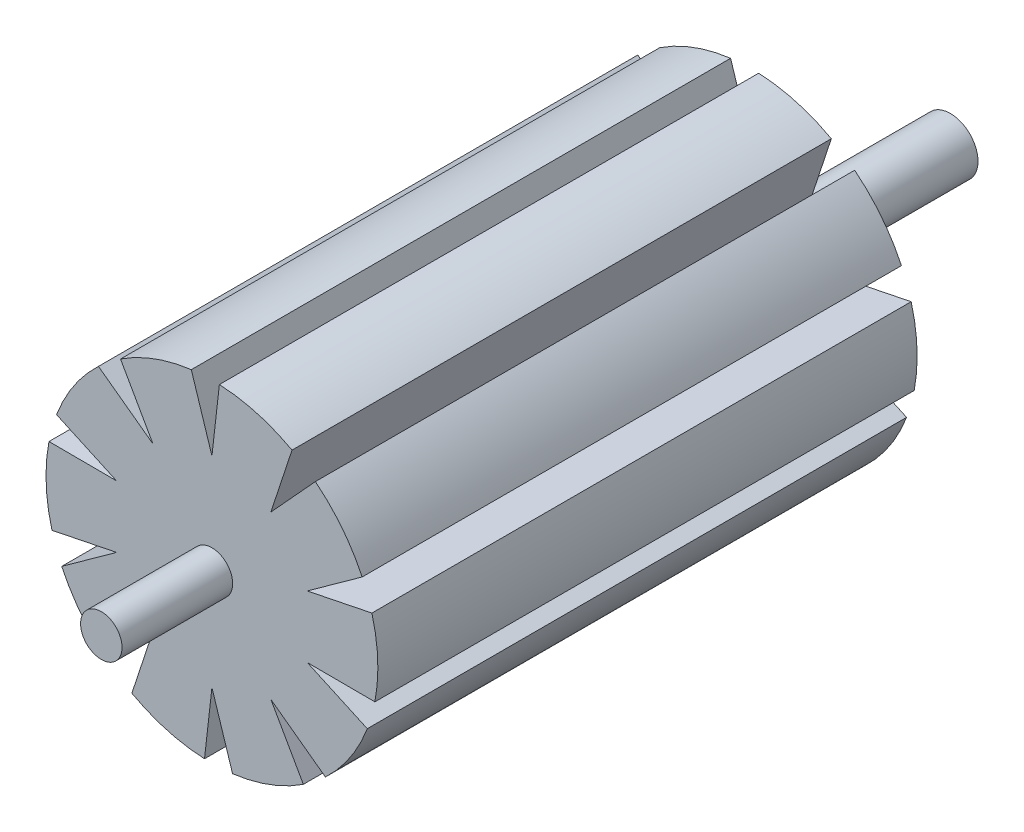
ISO-10303-21;
HEADER;
FILE_DESCRIPTION(('STEP AP214'),'2;1');
FILE_NAME('part.step','',(''),(''),'','','');
FILE_SCHEMA(('AUTOMOTIVE_DESIGN { 1 0 10303 214 1 1 1 1 }'));
ENDSEC;
DATA;
#1=APPLICATION_CONTEXT('core data for automotive mechanical design processes');
#2=APPLICATION_PROTOCOL_DEFINITION('international standard','automotive_design',2000,#1);
#3=PRODUCT_CONTEXT('',#1,'mechanical');
#4=PRODUCT('Part','Part','',(#3));
#5=PRODUCT_RELATED_PRODUCT_CATEGORY('part','',(#4));
#6=PRODUCT_DEFINITION_FORMATION('','',#4);
#7=PRODUCT_DEFINITION_CONTEXT('part definition',#1,'design');
#8=PRODUCT_DEFINITION('design','',#6,#7);
#9=PRODUCT_DEFINITION_SHAPE('','',#8);
#10=(LENGTH_UNIT() NAMED_UNIT(*) SI_UNIT(.MILLI.,.METRE.));
#11=(NAMED_UNIT(*) PLANE_ANGLE_UNIT() SI_UNIT($,.RADIAN.));
#12=(NAMED_UNIT(*) SI_UNIT($,.STERADIAN.) SOLID_ANGLE_UNIT());
#13=UNCERTAINTY_MEASURE_WITH_UNIT(LENGTH_MEASURE(1.E-05),#10,'distance_accuracy_value','');
#14=(GEOMETRIC_REPRESENTATION_CONTEXT(3) GLOBAL_UNCERTAINTY_ASSIGNED_CONTEXT((#13)) GLOBAL_UNIT_ASSIGNED_CONTEXT((#10,
#11,#12)) REPRESENTATION_CONTEXT('',''));
#15=CARTESIAN_POINT('',(0.,0.,0.));
#16=DIRECTION('',(0.,0.,1.));
#17=DIRECTION('',(1.,0.,0.));
#18=AXIS2_PLACEMENT_3D('',#15,#16,#17);
#19=CARTESIAN_POINT('',(0.,0.,19.5));
#20=DIRECTION('',(0.,0.,-1.));
#21=DIRECTION('',(-1.,0.,0.));
#22=AXIS2_PLACEMENT_3D('',#19,#20,#21);
#23=CYLINDRICAL_SURFACE('',#22,6.);
#24=DIRECTION('',(0.,0.,-1.));
#25=VECTOR('',#24,1.);
#26=CARTESIAN_POINT('',(3.30575995609394,-5.00718994174235,19.5));
#27=LINE('',#26,#25);
#28=CARTESIAN_POINT('',(3.30575995609394,-5.00718994174235,19.5));
#29=VERTEX_POINT('',#28);
#30=CARTESIAN_POINT('',(3.30575995609394,-5.00718994174235,0.));
#31=VERTEX_POINT('',#30);
#32=EDGE_CURVE('E591',#29,#31,#27,.T.);
#33=ORIENTED_EDGE('',*,*,#32,.F.);
#34=CARTESIAN_POINT('',(0.,0.,19.5));
#35=DIRECTION('',(0.,0.,1.));
#36=DIRECTION('',(1.,0.,0.));
#37=AXIS2_PLACEMENT_3D('',#34,#35,#36);
#38=CIRCLE('',#37,6.);
#39=CARTESIAN_POINT('',(0.745999923729571,-5.95344304699352,19.5));
#40=VERTEX_POINT('',#39);
#41=EDGE_CURVE('E618',#40,#29,#38,.T.);
#42=ORIENTED_EDGE('',*,*,#41,.F.);
#43=DIRECTION('',(0.,0.,-1.));
#44=VECTOR('',#43,1.);
#45=CARTESIAN_POINT('',(0.745999923729571,-5.95344304699352,19.5));
#46=LINE('',#45,#44);
#47=CARTESIAN_POINT('',(0.745999923729571,-5.95344304699352,0.));
#48=VERTEX_POINT('',#47);
#49=EDGE_CURVE('E583',#40,#48,#46,.T.);
#50=ORIENTED_EDGE('',*,*,#49,.T.);
#51=CARTESIAN_POINT('',(0.,0.,0.));
#52=DIRECTION('',(0.,0.,1.));
#53=DIRECTION('',(1.,0.,0.));
#54=AXIS2_PLACEMENT_3D('',#51,#52,#53);
#55=CIRCLE('',#54,6.);
#56=EDGE_CURVE('E635',#48,#31,#55,.T.);
#57=ORIENTED_EDGE('',*,*,#56,.T.);
#58=EDGE_LOOP('',(#33,#42,#50,#57));
#59=FACE_BOUND('',#58,.T.);
#60=ADVANCED_FACE('F147',(#59),#23,.T.);
#61=DIRECTION('',(0.,0.,-1.));
#62=VECTOR('',#61,1.);
#63=CARTESIAN_POINT('',(-0.268736419379183,-5.9939787067439,19.5));
#64=LINE('',#63,#62);
#65=CARTESIAN_POINT('',(-0.268736419379183,-5.9939787067439,19.5));
#66=VERTEX_POINT('',#65);
#67=CARTESIAN_POINT('',(-0.268736419379183,-5.9939787067439,0.));
#68=VERTEX_POINT('',#67);
#69=EDGE_CURVE('E577',#66,#68,#64,.T.);
#70=ORIENTED_EDGE('',*,*,#69,.F.);
#71=CARTESIAN_POINT('',(-2.89581940728632,-5.25492435344068,19.5));
#72=VERTEX_POINT('',#71);
#73=EDGE_CURVE('E693',#72,#66,#38,.T.);
#74=ORIENTED_EDGE('',*,*,#73,.F.);
#75=DIRECTION('',(0.,0.,-1.));
#76=VECTOR('',#75,1.);
#77=CARTESIAN_POINT('',(-2.89581940728632,-5.25492435344068,19.5));
#78=LINE('',#77,#76);
#79=CARTESIAN_POINT('',(-2.89581940728632,-5.25492435344068,0.));
#80=VERTEX_POINT('',#79);
#81=EDGE_CURVE('E528',#72,#80,#78,.T.);
#82=ORIENTED_EDGE('',*,*,#81,.T.);
#83=EDGE_CURVE('E639',#80,#68,#55,.T.);
#84=ORIENTED_EDGE('',*,*,#83,.T.);
#85=EDGE_LOOP('',(#70,#74,#82,#84));
#86=FACE_BOUND('',#85,.T.);
#87=ADVANCED_FACE('F756',(#86),#23,.T.);
#88=CARTESIAN_POINT('',(4.10287263948559,-4.37794884668157,19.5));
#89=VERTEX_POINT('',#88);
#90=CARTESIAN_POINT('',(5.61756838698754,-2.10782480712183,19.5));
#91=VERTEX_POINT('',#90);
#92=EDGE_CURVE('E610',#89,#91,#38,.T.);
#93=ORIENTED_EDGE('',*,*,#92,.F.);
#94=DIRECTION('',(0.,0.,-1.));
#95=VECTOR('',#94,1.);
#96=CARTESIAN_POINT('',(4.10287263948559,-4.37794884668157,19.5));
#97=LINE('',#96,#95);
#98=CARTESIAN_POINT('',(4.10287263948559,-4.37794884668157,0.));
#99=VERTEX_POINT('',#98);
#100=EDGE_CURVE('E597',#89,#99,#97,.T.);
#101=ORIENTED_EDGE('',*,*,#100,.T.);
#102=CARTESIAN_POINT('',(5.61756838698754,-2.10782480712183,0.));
#103=VERTEX_POINT('',#102);
#104=EDGE_CURVE('E629',#99,#103,#55,.T.);
#105=ORIENTED_EDGE('',*,*,#104,.T.);
#106=DIRECTION('',(0.,0.,-1.));
#107=VECTOR('',#106,1.);
#108=CARTESIAN_POINT('',(5.61756838698754,-2.10782480712183,19.5));
#109=LINE('',#108,#107);
#110=EDGE_CURVE('E173',#91,#103,#109,.T.);
#111=ORIENTED_EDGE('',*,*,#110,.F.);
#112=EDGE_LOOP('',(#93,#101,#105,#111));
#113=FACE_BOUND('',#112,.T.);
#114=ADVANCED_FACE('F713',(#113),#23,.T.);
#115=DIRECTION('',(0.,0.,-1.));
#116=VECTOR('',#115,1.);
#117=CARTESIAN_POINT('',(-3.30575995609394,5.00718994174235,19.5));
#118=LINE('',#117,#116);
#119=CARTESIAN_POINT('',(-3.30575995609394,5.00718994174235,19.5));
#120=VERTEX_POINT('',#119);
#121=CARTESIAN_POINT('',(-3.30575995609394,5.00718994174235,0.));
#122=VERTEX_POINT('',#121);
#123=EDGE_CURVE('E550',#120,#122,#118,.T.);
#124=ORIENTED_EDGE('',*,*,#123,.F.);
#125=CARTESIAN_POINT('',(-0.745999923729571,5.95344304699352,19.5));
#126=VERTEX_POINT('',#125);
#127=EDGE_CURVE('E680',#126,#120,#38,.T.);
#128=ORIENTED_EDGE('',*,*,#127,.F.);
#129=DIRECTION('',(0.,0.,-1.));
#130=VECTOR('',#129,1.);
#131=CARTESIAN_POINT('',(-0.745999923729571,5.95344304699352,19.5));
#132=LINE('',#131,#130);
#133=CARTESIAN_POINT('',(-0.745999923729571,5.95344304699352,0.));
#134=VERTEX_POINT('',#133);
#135=EDGE_CURVE('E507',#126,#134,#132,.T.);
#136=ORIENTED_EDGE('',*,*,#135,.T.);
#137=EDGE_CURVE('E626',#134,#122,#55,.T.);
#138=ORIENTED_EDGE('',*,*,#137,.T.);
#139=EDGE_LOOP('',(#124,#128,#136,#138));
#140=FACE_BOUND('',#139,.T.);
#141=ADVANCED_FACE('F665',(#140),#23,.T.);
#142=DIRECTION('',(0.,0.,-1.));
#143=VECTOR('',#142,1.);
#144=CARTESIAN_POINT('',(-5.78365662817882,-1.59665776148904,19.5));
#145=LINE('',#144,#143);
#146=CARTESIAN_POINT('',(-5.78365662817882,-1.59665776148904,19.5));
#147=VERTEX_POINT('',#146);
#148=CARTESIAN_POINT('',(-5.78365662817882,-1.59665776148904,0.));
#149=VERTEX_POINT('',#148);
#150=EDGE_CURVE('E536',#147,#149,#145,.T.);
#151=ORIENTED_EDGE('',*,*,#150,.F.);
#152=CARTESIAN_POINT('',(-5.89258745847011,1.13022698794567,19.5));
#153=VERTEX_POINT('',#152);
#154=EDGE_CURVE('E686',#153,#147,#38,.T.);
#155=ORIENTED_EDGE('',*,*,#154,.F.);
#156=DIRECTION('',(0.,0.,-1.));
#157=VECTOR('',#156,1.);
#158=CARTESIAN_POINT('',(-5.89258745847011,1.13022698794567,19.5));
#159=LINE('',#158,#157);
#160=CARTESIAN_POINT('',(-5.89258745847011,1.13022698794567,0.));
#161=VERTEX_POINT('',#160);
#162=EDGE_CURVE('E487',#153,#161,#159,.T.);
#163=ORIENTED_EDGE('',*,*,#162,.T.);
#164=EDGE_CURVE('E376',#161,#149,#55,.T.);
#165=ORIENTED_EDGE('',*,*,#164,.T.);
#166=EDGE_LOOP('',(#151,#155,#163,#165));
#167=FACE_BOUND('',#166,.T.);
#168=ADVANCED_FACE('F1003',(#167),#23,.T.);
#169=CARTESIAN_POINT('',(-5.43153415000041,-2.54920316518306,19.5));
#170=VERTEX_POINT('',#169);
#171=CARTESIAN_POINT('',(-3.74058461666441,-4.69127133361241,19.5));
#172=VERTEX_POINT('',#171);
#173=EDGE_CURVE('E689',#170,#172,#38,.T.);
#174=ORIENTED_EDGE('',*,*,#173,.F.);
#175=DIRECTION('',(0.,0.,-1.));
#176=VECTOR('',#175,1.);
#177=CARTESIAN_POINT('',(-5.43153415000041,-2.54920316518306,19.5));
#178=LINE('',#177,#176);
#179=CARTESIAN_POINT('',(-5.43153415000041,-2.54920316518306,0.));
#180=VERTEX_POINT('',#179);
#181=EDGE_CURVE('E542',#170,#180,#178,.T.);
#182=ORIENTED_EDGE('',*,*,#181,.T.);
#183=CARTESIAN_POINT('',(-3.74058461666441,-4.69127133361241,0.));
#184=VERTEX_POINT('',#183);
#185=EDGE_CURVE('E645',#180,#184,#55,.T.);
#186=ORIENTED_EDGE('',*,*,#185,.T.);
#187=DIRECTION('',(0.,0.,-1.));
#188=VECTOR('',#187,1.);
#189=CARTESIAN_POINT('',(-3.74058461666441,-4.69127133361241,19.5));
#190=LINE('',#189,#188);
#191=EDGE_CURVE('E522',#172,#184,#190,.T.);
#192=ORIENTED_EDGE('',*,*,#191,.F.);
#193=EDGE_LOOP('',(#174,#182,#186,#192));
#194=FACE_BOUND('',#193,.T.);
#195=ADVANCED_FACE('F995',(#194),#23,.T.);
#196=DIRECTION('',(0.,0.,-1.));
#197=VECTOR('',#196,1.);
#198=CARTESIAN_POINT('',(0.268736419379184,5.9939787067439,19.5));
#199=LINE('',#198,#197);
#200=CARTESIAN_POINT('',(0.268736419379184,5.9939787067439,19.5));
#201=VERTEX_POINT('',#200);
#202=CARTESIAN_POINT('',(0.268736419379184,5.9939787067439,0.));
#203=VERTEX_POINT('',#202);
#204=EDGE_CURVE('E515',#201,#203,#199,.T.);
#205=ORIENTED_EDGE('',*,*,#204,.F.);
#206=CARTESIAN_POINT('',(2.89581940728632,5.25492435344068,19.5));
#207=VERTEX_POINT('',#206);
#208=EDGE_CURVE('E157',#207,#201,#38,.T.);
#209=ORIENTED_EDGE('',*,*,#208,.F.);
#210=DIRECTION('',(0.,0.,-1.));
#211=VECTOR('',#210,1.);
#212=CARTESIAN_POINT('',(2.89581940728632,5.25492435344068,19.5));
#213=LINE('',#212,#211);
#214=CARTESIAN_POINT('',(2.89581940728632,5.25492435344068,0.));
#215=VERTEX_POINT('',#214);
#216=EDGE_CURVE('E500',#207,#215,#213,.T.);
#217=ORIENTED_EDGE('',*,*,#216,.T.);
#218=EDGE_CURVE('E620',#215,#203,#55,.T.);
#219=ORIENTED_EDGE('',*,*,#218,.T.);
#220=EDGE_LOOP('',(#205,#209,#217,#219));
#221=FACE_BOUND('',#220,.T.);
#222=ADVANCED_FACE('F740',(#221),#23,.T.);
#223=DIRECTION('',(0.,0.,-1.));
#224=VECTOR('',#223,1.);
#225=CARTESIAN_POINT('',(3.74058461666441,4.69127133361241,19.5));
#226=LINE('',#225,#224);
#227=CARTESIAN_POINT('',(3.74058461666441,4.69127133361241,19.5));
#228=VERTEX_POINT('',#227);
#229=CARTESIAN_POINT('',(3.74058461666441,4.69127133361241,0.));
#230=VERTEX_POINT('',#229);
#231=EDGE_CURVE('E494',#228,#230,#226,.T.);
#232=ORIENTED_EDGE('',*,*,#231,.F.);
#233=CARTESIAN_POINT('',(5.43153415000041,2.54920316518306,19.5));
#234=VERTEX_POINT('',#233);
#235=EDGE_CURVE('E12',#234,#228,#38,.T.);
#236=ORIENTED_EDGE('',*,*,#235,.F.);
#237=DIRECTION('',(0.,0.,-1.));
#238=VECTOR('',#237,1.);
#239=CARTESIAN_POINT('',(5.43153415000041,2.54920316518306,19.5));
#240=LINE('',#239,#238);
#241=CARTESIAN_POINT('',(5.43153415000041,2.54920316518306,0.));
#242=VERTEX_POINT('',#241);
#243=EDGE_CURVE('E476',#234,#242,#240,.T.);
#244=ORIENTED_EDGE('',*,*,#243,.T.);
#245=EDGE_CURVE('E611',#242,#230,#55,.T.);
#246=ORIENTED_EDGE('',*,*,#245,.T.);
#247=EDGE_LOOP('',(#232,#236,#244,#246));
#248=FACE_BOUND('',#247,.T.);
#249=ADVANCED_FACE('F727',(#248),#23,.T.);
#250=CARTESIAN_POINT('',(-4.10287263948559,4.37794884668157,19.5));
#251=VERTEX_POINT('',#250);
#252=CARTESIAN_POINT('',(-5.61756838698754,2.10782480712183,19.5));
#253=VERTEX_POINT('',#252);
#254=EDGE_CURVE('E682',#251,#253,#38,.T.);
#255=ORIENTED_EDGE('',*,*,#254,.F.);
#256=DIRECTION('',(0.,0.,-1.));
#257=VECTOR('',#256,1.);
#258=CARTESIAN_POINT('',(-4.10287263948559,4.37794884668158,19.5));
#259=LINE('',#258,#257);
#260=CARTESIAN_POINT('',(-4.10287263948559,4.37794884668157,0.));
#261=VERTEX_POINT('',#260);
#262=EDGE_CURVE('E556',#251,#261,#259,.T.);
#263=ORIENTED_EDGE('',*,*,#262,.T.);
#264=CARTESIAN_POINT('',(-5.61756838698754,2.10782480712183,0.));
#265=VERTEX_POINT('',#264);
#266=EDGE_CURVE('E655',#261,#265,#55,.T.);
#267=ORIENTED_EDGE('',*,*,#266,.T.);
#268=DIRECTION('',(0.,0.,-1.));
#269=VECTOR('',#268,1.);
#270=CARTESIAN_POINT('',(-5.61756838698754,2.10782480712183,19.5));
#271=LINE('',#270,#269);
#272=EDGE_CURVE('E365',#253,#265,#271,.T.);
#273=ORIENTED_EDGE('',*,*,#272,.F.);
#274=EDGE_LOOP('',(#255,#263,#267,#273));
#275=FACE_BOUND('',#274,.T.);
#276=ADVANCED_FACE('F762',(#275),#23,.T.);
#277=CARTESIAN_POINT('',(0.,0.,19.5));
#278=DIRECTION('',(0.,0.,1.));
#279=DIRECTION('',(1.,0.,0.));
#280=AXIS2_PLACEMENT_3D('',#277,#278,#279);
#281=PLANE('',#280);
#282=CARTESIAN_POINT('',(0.,0.,19.5));
#283=DIRECTION('',(0.,0.,1.));
#284=DIRECTION('',(1.,0.,0.));
#285=AXIS2_PLACEMENT_3D('',#282,#283,#284);
#286=CIRCLE('',#285,0.75);
#287=CARTESIAN_POINT('',(0.75,0.,19.5));
#288=VERTEX_POINT('',#287);
#289=EDGE_CURVE('E1064',#288,#288,#286,.T.);
#290=ORIENTED_EDGE('',*,*,#289,.F.);
#291=EDGE_LOOP('',(#290));
#292=FACE_BOUND('',#291,.T.);
#293=DIRECTION('',(-0.806575266756995,0.591131405912326,0.));
#294=VECTOR('',#293,1.);
#295=CARTESIAN_POINT('',(-0.653678066596557,-0.891917694889844,19.5));
#296=LINE('',#295,#294);
#297=CARTESIAN_POINT('',(2.1305526188517,-2.93245410519999,19.5));
#298=VERTEX_POINT('',#297);
#299=EDGE_CURVE('E594',#89,#298,#296,.T.);
#300=ORIENTED_EDGE('',*,*,#299,.F.);
#301=ORIENTED_EDGE('',*,*,#92,.T.);
#302=DIRECTION('',(-0.910169783029026,0.414235399333393,0.));
#303=VECTOR('',#302,1.);
#304=CARTESIAN_POINT('',(0.169222300681132,0.371820044695544,19.5));
#305=LINE('',#304,#303);
#306=CARTESIAN_POINT('',(3.44730655212215,-1.12009779773724,19.5));
#307=VERTEX_POINT('',#306);
#308=EDGE_CURVE('E560',#91,#307,#305,.T.);
#309=ORIENTED_EDGE('',*,*,#308,.T.);
#310=DIRECTION('',(-0.999991420611096,0.00414230662819796,0.));
#311=VECTOR('',#310,1.);
#312=CARTESIAN_POINT('',(-0.00458059741182512,-1.10579890004213,19.5));
#313=LINE('',#312,#311);
#314=CARTESIAN_POINT('',(5.89258745847011,-1.13022698794567,19.5));
#315=VERTEX_POINT('',#314);
#316=EDGE_CURVE('E566',#315,#307,#313,.T.);
#317=ORIENTED_EDGE('',*,*,#316,.F.);
#318=CARTESIAN_POINT('',(5.78365662817882,1.59665776148903,19.5));
#319=VERTEX_POINT('',#318);
#320=EDGE_CURVE('E158',#315,#319,#38,.T.);
#321=ORIENTED_EDGE('',*,*,#320,.T.);
#322=DIRECTION('',(-0.979824280942692,-0.199860897814294,0.));
#323=VECTOR('',#322,1.);
#324=CARTESIAN_POINT('',(-0.0816466217005058,0.40027510770732,19.5));
#325=LINE('',#324,#323);
#326=CARTESIAN_POINT('',(3.44730655212215,1.12009779773724,19.5));
#327=VERTEX_POINT('',#326);
#328=EDGE_CURVE('E466',#319,#327,#325,.T.);
#329=ORIENTED_EDGE('',*,*,#328,.T.);
#330=DIRECTION('',(-0.811444840250051,-0.584429012996078,0.));
#331=VECTOR('',#330,1.);
#332=CARTESIAN_POINT('',(0.646266504295445,-0.897302510100564,19.5));
#333=LINE('',#332,#331);
#334=EDGE_CURVE('E473',#234,#327,#333,.T.);
#335=ORIENTED_EDGE('',*,*,#334,.F.);
#336=ORIENTED_EDGE('',*,*,#235,.T.);
#337=DIRECTION('',(-0.675219206538676,-0.73761712501899,0.));
#338=VECTOR('',#337,1.);
#339=CARTESIAN_POINT('',(-0.301329309659155,0.275838684425424,19.5));
#340=LINE('',#339,#338);
#341=CARTESIAN_POINT('',(2.1305526188517,2.93245410519999,19.5));
#342=VERTEX_POINT('',#341);
#343=EDGE_CURVE('E490',#228,#342,#340,.T.);
#344=ORIENTED_EDGE('',*,*,#343,.T.);
#345=DIRECTION('',(-0.312953910909215,-0.949768313667405,0.));
#346=VECTOR('',#345,1.);
#347=CARTESIAN_POINT('',(1.05026176715243,-0.346067059491182,19.5));
#348=LINE('',#347,#346);
#349=EDGE_CURVE('E497',#207,#342,#348,.T.);
#350=ORIENTED_EDGE('',*,*,#349,.F.);
#351=ORIENTED_EDGE('',*,*,#208,.T.);
#352=DIRECTION('',(-0.112703345093621,-0.993628681150413,0.));
#353=VECTOR('',#352,1.);
#354=CARTESIAN_POINT('',(-0.40591444313455,0.0460412591050731,19.5));
#355=LINE('',#354,#353);
#356=CARTESIAN_POINT('',(0.,3.62471261492551,19.5));
#357=VERTEX_POINT('',#356);
#358=EDGE_CURVE('E511',#201,#357,#355,.T.);
#359=ORIENTED_EDGE('',*,*,#358,.T.);
#360=DIRECTION('',(0.305074775486734,-0.952328399955456,0.));
#361=VECTOR('',#360,1.);
#362=CARTESIAN_POINT('',(1.05309273204172,0.3373542454571,19.5));
#363=LINE('',#362,#361);
#364=EDGE_CURVE('E504',#126,#357,#363,.T.);
#365=ORIENTED_EDGE('',*,*,#364,.F.);
#366=ORIENTED_EDGE('',*,*,#127,.T.);
#367=DIRECTION('',(0.492861363531389,-0.870107853279109,0.));
#368=VECTOR('',#367,1.);
#369=CARTESIAN_POINT('',(-0.355454055857033,-0.201342362308576,19.5));
#370=LINE('',#369,#368);
#371=CARTESIAN_POINT('',(-2.1305526188517,2.93245410519999,19.5));
#372=VERTEX_POINT('',#371);
#373=EDGE_CURVE('E546',#120,#372,#370,.T.);
#374=ORIENTED_EDGE('',*,*,#373,.T.);
#375=DIRECTION('',(0.806575266756995,-0.591131405912326,0.));
#376=VECTOR('',#375,1.);
#377=CARTESIAN_POINT('',(0.653678066596557,0.891917694889844,19.5));
#378=LINE('',#377,#376);
#379=EDGE_CURVE('E553',#251,#372,#378,.T.);
#380=ORIENTED_EDGE('',*,*,#379,.F.);
#381=ORIENTED_EDGE('',*,*,#254,.T.);
#382=DIRECTION('',(0.910169783029026,-0.414235399333393,0.));
#383=VECTOR('',#382,1.);
#384=CARTESIAN_POINT('',(-0.169222300681132,-0.371820044695544,19.5));
#385=LINE('',#384,#383);
#386=CARTESIAN_POINT('',(-3.44730655212215,1.12009779773724,19.5));
#387=VERTEX_POINT('',#386);
#388=EDGE_CURVE('E480',#253,#387,#385,.T.);
#389=ORIENTED_EDGE('',*,*,#388,.T.);
#390=DIRECTION('',(0.999991420611096,-0.00414230662819782,0.));
#391=VECTOR('',#390,1.);
#392=CARTESIAN_POINT('',(0.00458059741182497,1.10579890004213,19.5));
#393=LINE('',#392,#391);
#394=EDGE_CURVE('E355',#153,#387,#393,.T.);
#395=ORIENTED_EDGE('',*,*,#394,.F.);
#396=ORIENTED_EDGE('',*,*,#154,.T.);
#397=DIRECTION('',(0.979824280942692,0.199860897814294,0.));
#398=VECTOR('',#397,1.);
#399=CARTESIAN_POINT('',(0.0816466217005059,-0.40027510770732,19.5));
#400=LINE('',#399,#398);
#401=CARTESIAN_POINT('',(-3.44730655212215,-1.12009779773724,19.5));
#402=VERTEX_POINT('',#401);
#403=EDGE_CURVE('E532',#147,#402,#400,.T.);
#404=ORIENTED_EDGE('',*,*,#403,.T.);
#405=DIRECTION('',(0.811444840250051,0.584429012996078,0.));
#406=VECTOR('',#405,1.);
#407=CARTESIAN_POINT('',(-0.646266504295445,0.897302510100564,19.5));
#408=LINE('',#407,#406);
#409=EDGE_CURVE('E539',#170,#402,#408,.T.);
#410=ORIENTED_EDGE('',*,*,#409,.F.);
#411=ORIENTED_EDGE('',*,*,#173,.T.);
#412=DIRECTION('',(0.675219206538676,0.73761712501899,0.));
#413=VECTOR('',#412,1.);
#414=CARTESIAN_POINT('',(0.301329309659156,-0.275838684425425,19.5));
#415=LINE('',#414,#413);
#416=CARTESIAN_POINT('',(-2.1305526188517,-2.93245410519999,19.5));
#417=VERTEX_POINT('',#416);
#418=EDGE_CURVE('E518',#172,#417,#415,.T.);
#419=ORIENTED_EDGE('',*,*,#418,.T.);
#420=DIRECTION('',(0.312953910909215,0.949768313667406,0.));
#421=VECTOR('',#420,1.);
#422=CARTESIAN_POINT('',(-1.05026176715243,0.346067059491182,19.5));
#423=LINE('',#422,#421);
#424=EDGE_CURVE('E525',#72,#417,#423,.T.);
#425=ORIENTED_EDGE('',*,*,#424,.F.);
#426=ORIENTED_EDGE('',*,*,#73,.T.);
#427=DIRECTION('',(0.112703345093621,0.993628681150413,0.));
#428=VECTOR('',#427,1.);
#429=CARTESIAN_POINT('',(0.40591444313455,-0.046041259105073,19.5));
#430=LINE('',#429,#428);
#431=CARTESIAN_POINT('',(0.,-3.62471261492551,19.5));
#432=VERTEX_POINT('',#431);
#433=EDGE_CURVE('E573',#66,#432,#430,.T.);
#434=ORIENTED_EDGE('',*,*,#433,.T.);
#435=DIRECTION('',(-0.305074775486735,0.952328399955456,0.));
#436=VECTOR('',#435,1.);
#437=CARTESIAN_POINT('',(-1.05309273204172,-0.3373542454571,19.5));
#438=LINE('',#437,#436);
#439=EDGE_CURVE('E580',#40,#432,#438,.T.);
#440=ORIENTED_EDGE('',*,*,#439,.F.);
#441=ORIENTED_EDGE('',*,*,#41,.T.);
#442=DIRECTION('',(-0.492861363531389,0.870107853279109,0.));
#443=VECTOR('',#442,1.);
#444=CARTESIAN_POINT('',(0.355454055857033,0.201342362308576,19.5));
#445=LINE('',#444,#443);
#446=EDGE_CURVE('E587',#29,#298,#445,.T.);
#447=ORIENTED_EDGE('',*,*,#446,.T.);
#448=EDGE_LOOP('',(#300,#301,#309,#317,#321,#329,#335,#336,#344,#350,#351,#359,#365,#366,#374,
#380,#381,#389,#395,#396,#404,#410,#411,#419,#425,#426,#434,#440,#441,#447));
#449=FACE_BOUND('',#448,.T.);
#450=ADVANCED_FACE('F676',(#292,#449),#281,.T.);
#451=CARTESIAN_POINT('',(0.,0.,0.));
#452=DIRECTION('',(0.,0.,1.));
#453=DIRECTION('',(1.,0.,0.));
#454=AXIS2_PLACEMENT_3D('',#451,#452,#453);
#455=PLANE('',#454);
#456=CARTESIAN_POINT('',(0.,0.,0.));
#457=DIRECTION('',(0.,0.,1.));
#458=DIRECTION('',(1.,0.,0.));
#459=AXIS2_PLACEMENT_3D('',#456,#457,#458);
#460=CIRCLE('',#459,1.);
#461=CARTESIAN_POINT('',(1.,0.,0.));
#462=VERTEX_POINT('',#461);
#463=EDGE_CURVE('E601',#462,#462,#460,.T.);
#464=ORIENTED_EDGE('',*,*,#463,.T.);
#465=EDGE_LOOP('',(#464));
#466=FACE_BOUND('',#465,.T.);
#467=ORIENTED_EDGE('',*,*,#104,.F.);
#468=DIRECTION('',(0.806575266756995,-0.591131405912326,0.));
#469=VECTOR('',#468,1.);
#470=CARTESIAN_POINT('',(2.1305526188517,-2.93245410519999,0.));
#471=LINE('',#470,#469);
#472=CARTESIAN_POINT('',(2.1305526188517,-2.93245410519999,0.));
#473=VERTEX_POINT('',#472);
#474=EDGE_CURVE('E406',#473,#99,#471,.T.);
#475=ORIENTED_EDGE('',*,*,#474,.F.);
#476=DIRECTION('',(0.492861363531389,-0.870107853279109,0.));
#477=VECTOR('',#476,1.);
#478=CARTESIAN_POINT('',(2.1305526188517,-2.93245410519999,0.));
#479=LINE('',#478,#477);
#480=EDGE_CURVE('E402',#473,#31,#479,.T.);
#481=ORIENTED_EDGE('',*,*,#480,.T.);
#482=ORIENTED_EDGE('',*,*,#56,.F.);
#483=DIRECTION('',(0.305074775486735,-0.952328399955456,0.));
#484=VECTOR('',#483,1.);
#485=CARTESIAN_POINT('',(0.,-3.62471261492551,0.));
#486=LINE('',#485,#484);
#487=CARTESIAN_POINT('',(0.,-3.62471261492551,0.));
#488=VERTEX_POINT('',#487);
#489=EDGE_CURVE('E416',#488,#48,#486,.T.);
#490=ORIENTED_EDGE('',*,*,#489,.F.);
#491=DIRECTION('',(-0.112703345093621,-0.993628681150413,0.));
#492=VECTOR('',#491,1.);
#493=CARTESIAN_POINT('',(0.,-3.62471261492551,0.));
#494=LINE('',#493,#492);
#495=EDGE_CURVE('E412',#488,#68,#494,.T.);
#496=ORIENTED_EDGE('',*,*,#495,.T.);
#497=ORIENTED_EDGE('',*,*,#83,.F.);
#498=DIRECTION('',(-0.312953910909215,-0.949768313667405,0.));
#499=VECTOR('',#498,1.);
#500=CARTESIAN_POINT('',(-2.1305526188517,-2.93245410519999,0.));
#501=LINE('',#500,#499);
#502=CARTESIAN_POINT('',(-2.1305526188517,-2.93245410519999,0.));
#503=VERTEX_POINT('',#502);
#504=EDGE_CURVE('E446',#503,#80,#501,.T.);
#505=ORIENTED_EDGE('',*,*,#504,.F.);
#506=DIRECTION('',(-0.675219206538676,-0.73761712501899,0.));
#507=VECTOR('',#506,1.);
#508=CARTESIAN_POINT('',(-2.1305526188517,-2.93245410519999,0.));
#509=LINE('',#508,#507);
#510=EDGE_CURVE('E442',#503,#184,#509,.T.);
#511=ORIENTED_EDGE('',*,*,#510,.T.);
#512=ORIENTED_EDGE('',*,*,#185,.F.);
#513=DIRECTION('',(-0.811444840250051,-0.584429012996078,0.));
#514=VECTOR('',#513,1.);
#515=CARTESIAN_POINT('',(-3.44730655212215,-1.12009779773724,0.));
#516=LINE('',#515,#514);
#517=CARTESIAN_POINT('',(-3.44730655212215,-1.12009779773724,0.));
#518=VERTEX_POINT('',#517);
#519=EDGE_CURVE('E435',#518,#180,#516,.T.);
#520=ORIENTED_EDGE('',*,*,#519,.F.);
#521=DIRECTION('',(-0.979824280942693,-0.199860897814294,0.));
#522=VECTOR('',#521,1.);
#523=CARTESIAN_POINT('',(-3.44730655212215,-1.12009779773724,0.));
#524=LINE('',#523,#522);
#525=EDGE_CURVE('E452',#518,#149,#524,.T.);
#526=ORIENTED_EDGE('',*,*,#525,.T.);
#527=ORIENTED_EDGE('',*,*,#164,.F.);
#528=DIRECTION('',(-0.999991420611096,0.00414230662819782,0.));
#529=VECTOR('',#528,1.);
#530=CARTESIAN_POINT('',(-3.44730655212215,1.12009779773724,0.));
#531=LINE('',#530,#529);
#532=CARTESIAN_POINT('',(-3.44730655212215,1.12009779773724,0.));
#533=VERTEX_POINT('',#532);
#534=EDGE_CURVE('E352',#533,#161,#531,.T.);
#535=ORIENTED_EDGE('',*,*,#534,.F.);
#536=DIRECTION('',(-0.910169783029026,0.414235399333393,0.));
#537=VECTOR('',#536,1.);
#538=CARTESIAN_POINT('',(-3.44730655212215,1.12009779773724,0.));
#539=LINE('',#538,#537);
#540=EDGE_CURVE('E359',#533,#265,#539,.T.);
#541=ORIENTED_EDGE('',*,*,#540,.T.);
#542=ORIENTED_EDGE('',*,*,#266,.F.);
#543=DIRECTION('',(-0.806575266756995,0.591131405912326,0.));
#544=VECTOR('',#543,1.);
#545=CARTESIAN_POINT('',(-2.1305526188517,2.93245410519999,0.));
#546=LINE('',#545,#544);
#547=CARTESIAN_POINT('',(-2.1305526188517,2.93245410519999,0.));
#548=VERTEX_POINT('',#547);
#549=EDGE_CURVE('E388',#548,#261,#546,.T.);
#550=ORIENTED_EDGE('',*,*,#549,.F.);
#551=DIRECTION('',(-0.492861363531389,0.870107853279109,0.));
#552=VECTOR('',#551,1.);
#553=CARTESIAN_POINT('',(-2.1305526188517,2.93245410519999,0.));
#554=LINE('',#553,#552);
#555=EDGE_CURVE('E381',#548,#122,#554,.T.);
#556=ORIENTED_EDGE('',*,*,#555,.T.);
#557=ORIENTED_EDGE('',*,*,#137,.F.);
#558=DIRECTION('',(-0.305074775486734,0.952328399955456,0.));
#559=VECTOR('',#558,1.);
#560=CARTESIAN_POINT('',(0.,3.62471261492551,0.));
#561=LINE('',#560,#559);
#562=CARTESIAN_POINT('',(0.,3.62471261492551,0.));
#563=VERTEX_POINT('',#562);
#564=EDGE_CURVE('E434',#563,#134,#561,.T.);
#565=ORIENTED_EDGE('',*,*,#564,.F.);
#566=DIRECTION('',(0.112703345093621,0.993628681150413,0.));
#567=VECTOR('',#566,1.);
#568=CARTESIAN_POINT('',(0.,3.62471261492551,0.));
#569=LINE('',#568,#567);
#570=EDGE_CURVE('E165',#563,#203,#569,.T.);
#571=ORIENTED_EDGE('',*,*,#570,.T.);
#572=ORIENTED_EDGE('',*,*,#218,.F.);
#573=DIRECTION('',(0.312953910909215,0.949768313667405,0.));
#574=VECTOR('',#573,1.);
#575=CARTESIAN_POINT('',(2.1305526188517,2.93245410519999,0.));
#576=LINE('',#575,#574);
#577=CARTESIAN_POINT('',(2.1305526188517,2.93245410519999,0.));
#578=VERTEX_POINT('',#577);
#579=EDGE_CURVE('E427',#578,#215,#576,.T.);
#580=ORIENTED_EDGE('',*,*,#579,.F.);
#581=DIRECTION('',(0.675219206538676,0.73761712501899,0.));
#582=VECTOR('',#581,1.);
#583=CARTESIAN_POINT('',(2.1305526188517,2.93245410519999,0.));
#584=LINE('',#583,#582);
#585=EDGE_CURVE('E423',#578,#230,#584,.T.);
#586=ORIENTED_EDGE('',*,*,#585,.T.);
#587=ORIENTED_EDGE('',*,*,#245,.F.);
#588=DIRECTION('',(0.811444840250051,0.584429012996078,0.));
#589=VECTOR('',#588,1.);
#590=CARTESIAN_POINT('',(3.44730655212215,1.12009779773724,0.));
#591=LINE('',#590,#589);
#592=CARTESIAN_POINT('',(3.44730655212215,1.12009779773724,0.));
#593=VERTEX_POINT('',#592);
#594=EDGE_CURVE('E430',#593,#242,#591,.T.);
#595=ORIENTED_EDGE('',*,*,#594,.F.);
#596=DIRECTION('',(0.979824280942693,0.199860897814294,0.));
#597=VECTOR('',#596,1.);
#598=CARTESIAN_POINT('',(3.44730655212215,1.12009779773724,0.));
#599=LINE('',#598,#597);
#600=CARTESIAN_POINT('',(5.78365662817882,1.59665776148903,0.));
#601=VERTEX_POINT('',#600);
#602=EDGE_CURVE('E459',#593,#601,#599,.T.);
#603=ORIENTED_EDGE('',*,*,#602,.T.);
#604=CARTESIAN_POINT('',(5.89258745847011,-1.13022698794567,0.));
#605=VERTEX_POINT('',#604);
#606=EDGE_CURVE('E151',#605,#601,#55,.T.);
#607=ORIENTED_EDGE('',*,*,#606,.F.);
#608=DIRECTION('',(0.999991420611096,-0.00414230662819796,0.));
#609=VECTOR('',#608,1.);
#610=CARTESIAN_POINT('',(3.44730655212215,-1.12009779773724,0.));
#611=LINE('',#610,#609);
#612=CARTESIAN_POINT('',(3.44730655212215,-1.12009779773724,0.));
#613=VERTEX_POINT('',#612);
#614=EDGE_CURVE('E391',#613,#605,#611,.T.);
#615=ORIENTED_EDGE('',*,*,#614,.F.);
#616=DIRECTION('',(0.910169783029026,-0.414235399333393,0.));
#617=VECTOR('',#616,1.);
#618=CARTESIAN_POINT('',(3.44730655212215,-1.12009779773724,0.));
#619=LINE('',#618,#617);
#620=EDGE_CURVE('E387',#613,#103,#619,.T.);
#621=ORIENTED_EDGE('',*,*,#620,.T.);
#622=EDGE_LOOP('',(#467,#475,#481,#482,#490,#496,#497,#505,#511,#512,#520,#526,#527,#535,#541,
#542,#550,#556,#557,#565,#571,#572,#580,#586,#587,#595,#603,#607,#615,#621));
#623=FACE_BOUND('',#622,.T.);
#624=ADVANCED_FACE('F373',(#466,#623),#455,.F.);
#625=ORIENTED_EDGE('',*,*,#320,.F.);
#626=DIRECTION('',(0.,0.,-1.));
#627=VECTOR('',#626,1.);
#628=CARTESIAN_POINT('',(5.89258745847011,-1.13022698794567,19.5));
#629=LINE('',#628,#627);
#630=EDGE_CURVE('E569',#315,#605,#629,.T.);
#631=ORIENTED_EDGE('',*,*,#630,.T.);
#632=ORIENTED_EDGE('',*,*,#606,.T.);
#633=DIRECTION('',(0.,0.,-1.));
#634=VECTOR('',#633,1.);
#635=CARTESIAN_POINT('',(5.78365662817882,1.59665776148903,19.5));
#636=LINE('',#635,#634);
#637=EDGE_CURVE('E470',#319,#601,#636,.T.);
#638=ORIENTED_EDGE('',*,*,#637,.F.);
#639=EDGE_LOOP('',(#625,#631,#632,#638));
#640=FACE_BOUND('',#639,.T.);
#641=ADVANCED_FACE('F149',(#640),#23,.T.);
#642=CARTESIAN_POINT('',(0.,0.,-7.2));
#643=DIRECTION('',(0.,0.,1.));
#644=DIRECTION('',(1.,0.,0.));
#645=AXIS2_PLACEMENT_3D('',#642,#643,#644);
#646=CYLINDRICAL_SURFACE('',#645,1.);
#647=CARTESIAN_POINT('',(0.,0.,-7.2));
#648=DIRECTION('',(0.,0.,1.));
#649=DIRECTION('',(1.,0.,0.));
#650=AXIS2_PLACEMENT_3D('',#647,#648,#649);
#651=CIRCLE('',#650,1.);
#652=CARTESIAN_POINT('',(1.,0.,-7.2));
#653=VERTEX_POINT('',#652);
#654=EDGE_CURVE('E602',#653,#653,#651,.T.);
#655=ORIENTED_EDGE('',*,*,#654,.T.);
#656=EDGE_LOOP('',(#655));
#657=FACE_BOUND('',#656,.T.);
#658=ORIENTED_EDGE('',*,*,#463,.F.);
#659=EDGE_LOOP('',(#658));
#660=FACE_BOUND('',#659,.T.);
#661=ADVANCED_FACE('F761',(#657,#660),#646,.T.);
#662=CARTESIAN_POINT('',(0.,0.,-7.2));
#663=DIRECTION('',(0.,0.,1.));
#664=DIRECTION('',(1.,0.,0.));
#665=AXIS2_PLACEMENT_3D('',#662,#663,#664);
#666=PLANE('',#665);
#667=ORIENTED_EDGE('',*,*,#654,.F.);
#668=EDGE_LOOP('',(#667));
#669=FACE_BOUND('',#668,.T.);
#670=ADVANCED_FACE('F767',(#669),#666,.F.);
#671=CARTESIAN_POINT('',(3.44730655212215,1.12009779773724,55.));
#672=DIRECTION('',(-0.584429012996078,0.811444840250051,0.));
#673=DIRECTION('',(-0.811444840250051,-0.584429012996078,0.));
#674=AXIS2_PLACEMENT_3D('',#671,#672,#673);
#675=PLANE('',#674);
#676=ORIENTED_EDGE('',*,*,#334,.T.);
#677=DIRECTION('',(0.,0.,-1.));
#678=VECTOR('',#677,1.);
#679=CARTESIAN_POINT('',(3.44730655212215,1.12009779773724,55.));
#680=LINE('',#679,#678);
#681=EDGE_CURVE('E463',#327,#593,#680,.T.);
#682=ORIENTED_EDGE('',*,*,#681,.T.);
#683=ORIENTED_EDGE('',*,*,#594,.T.);
#684=ORIENTED_EDGE('',*,*,#243,.F.);
#685=EDGE_LOOP('',(#676,#682,#683,#684));
#686=FACE_BOUND('',#685,.T.);
#687=ADVANCED_FACE('F948',(#686),#675,.F.);
#688=CARTESIAN_POINT('',(3.44730655212215,1.12009779773724,55.));
#689=DIRECTION('',(-0.199860897814294,0.979824280942692,0.));
#690=DIRECTION('',(-0.979824280942692,-0.199860897814294,0.));
#691=AXIS2_PLACEMENT_3D('',#688,#689,#690);
#692=PLANE('',#691);
#693=ORIENTED_EDGE('',*,*,#637,.T.);
#694=ORIENTED_EDGE('',*,*,#602,.F.);
#695=ORIENTED_EDGE('',*,*,#681,.F.);
#696=ORIENTED_EDGE('',*,*,#328,.F.);
#697=EDGE_LOOP('',(#693,#694,#695,#696));
#698=FACE_BOUND('',#697,.T.);
#699=ADVANCED_FACE('F723',(#698),#692,.T.);
#700=CARTESIAN_POINT('',(-3.44730655212215,1.12009779773724,55.));
#701=DIRECTION('',(-0.00414230662819782,-0.999991420611096,0.));
#702=DIRECTION('',(0.999991420611096,-0.00414230662819782,0.));
#703=AXIS2_PLACEMENT_3D('',#700,#701,#702);
#704=PLANE('',#703);
#705=ORIENTED_EDGE('',*,*,#394,.T.);
#706=DIRECTION('',(0.,0.,-1.));
#707=VECTOR('',#706,1.);
#708=CARTESIAN_POINT('',(-3.44730655212215,1.12009779773724,55.));
#709=LINE('',#708,#707);
#710=EDGE_CURVE('E348',#387,#533,#709,.T.);
#711=ORIENTED_EDGE('',*,*,#710,.T.);
#712=ORIENTED_EDGE('',*,*,#534,.T.);
#713=ORIENTED_EDGE('',*,*,#162,.F.);
#714=EDGE_LOOP('',(#705,#711,#712,#713));
#715=FACE_BOUND('',#714,.T.);
#716=ADVANCED_FACE('F350',(#715),#704,.F.);
#717=CARTESIAN_POINT('',(-3.44730655212215,1.12009779773724,55.));
#718=DIRECTION('',(-0.414235399333393,-0.910169783029026,0.));
#719=DIRECTION('',(0.910169783029026,-0.414235399333393,0.));
#720=AXIS2_PLACEMENT_3D('',#717,#718,#719);
#721=PLANE('',#720);
#722=ORIENTED_EDGE('',*,*,#272,.T.);
#723=ORIENTED_EDGE('',*,*,#540,.F.);
#724=ORIENTED_EDGE('',*,*,#710,.F.);
#725=ORIENTED_EDGE('',*,*,#388,.F.);
#726=EDGE_LOOP('',(#722,#723,#724,#725));
#727=FACE_BOUND('',#726,.T.);
#728=ADVANCED_FACE('F363',(#727),#721,.T.);
#729=CARTESIAN_POINT('',(2.1305526188517,2.93245410519999,55.));
#730=DIRECTION('',(-0.949768313667405,0.312953910909215,0.));
#731=DIRECTION('',(-0.312953910909215,-0.949768313667405,0.));
#732=AXIS2_PLACEMENT_3D('',#729,#730,#731);
#733=PLANE('',#732);
#734=ORIENTED_EDGE('',*,*,#349,.T.);
#735=DIRECTION('',(0.,0.,-1.));
#736=VECTOR('',#735,1.);
#737=CARTESIAN_POINT('',(2.1305526188517,2.93245410519999,55.));
#738=LINE('',#737,#736);
#739=EDGE_CURVE('E420',#342,#578,#738,.T.);
#740=ORIENTED_EDGE('',*,*,#739,.T.);
#741=ORIENTED_EDGE('',*,*,#579,.T.);
#742=ORIENTED_EDGE('',*,*,#216,.F.);
#743=EDGE_LOOP('',(#734,#740,#741,#742));
#744=FACE_BOUND('',#743,.T.);
#745=ADVANCED_FACE('F735',(#744),#733,.F.);
#746=CARTESIAN_POINT('',(2.1305526188517,2.93245410519999,55.));
#747=DIRECTION('',(-0.73761712501899,0.675219206538676,0.));
#748=DIRECTION('',(-0.675219206538676,-0.73761712501899,0.));
#749=AXIS2_PLACEMENT_3D('',#746,#747,#748);
#750=PLANE('',#749);
#751=ORIENTED_EDGE('',*,*,#231,.T.);
#752=ORIENTED_EDGE('',*,*,#585,.F.);
#753=ORIENTED_EDGE('',*,*,#739,.F.);
#754=ORIENTED_EDGE('',*,*,#343,.F.);
#755=EDGE_LOOP('',(#751,#752,#753,#754));
#756=FACE_BOUND('',#755,.T.);
#757=ADVANCED_FACE('F730',(#756),#750,.T.);
#758=CARTESIAN_POINT('',(0.,3.62471261492551,55.));
#759=DIRECTION('',(-0.993628681150412,0.112703345093621,0.));
#760=DIRECTION('',(-0.112703345093621,-0.993628681150413,0.));
#761=AXIS2_PLACEMENT_3D('',#758,#759,#760);
#762=PLANE('',#761);
#763=ORIENTED_EDGE('',*,*,#204,.T.);
#764=ORIENTED_EDGE('',*,*,#570,.F.);
#765=DIRECTION('',(0.,0.,-1.));
#766=VECTOR('',#765,1.);
#767=CARTESIAN_POINT('',(0.,3.62471261492551,55.));
#768=LINE('',#767,#766);
#769=EDGE_CURVE('E431',#357,#563,#768,.T.);
#770=ORIENTED_EDGE('',*,*,#769,.F.);
#771=ORIENTED_EDGE('',*,*,#358,.F.);
#772=EDGE_LOOP('',(#763,#764,#770,#771));
#773=FACE_BOUND('',#772,.T.);
#774=ADVANCED_FACE('F741',(#773),#762,.T.);
#775=CARTESIAN_POINT('',(0.,3.62471261492551,55.));
#776=DIRECTION('',(-0.952328399955456,-0.305074775486734,0.));
#777=DIRECTION('',(0.305074775486734,-0.952328399955456,0.));
#778=AXIS2_PLACEMENT_3D('',#775,#776,#777);
#779=PLANE('',#778);
#780=ORIENTED_EDGE('',*,*,#364,.T.);
#781=ORIENTED_EDGE('',*,*,#769,.T.);
#782=ORIENTED_EDGE('',*,*,#564,.T.);
#783=ORIENTED_EDGE('',*,*,#135,.F.);
#784=EDGE_LOOP('',(#780,#781,#782,#783));
#785=FACE_BOUND('',#784,.T.);
#786=ADVANCED_FACE('F743',(#785),#779,.F.);
#787=CARTESIAN_POINT('',(-2.1305526188517,-2.93245410519999,55.));
#788=DIRECTION('',(0.949768313667405,-0.312953910909215,0.));
#789=DIRECTION('',(0.312953910909215,0.949768313667406,0.));
#790=AXIS2_PLACEMENT_3D('',#787,#788,#789);
#791=PLANE('',#790);
#792=ORIENTED_EDGE('',*,*,#424,.T.);
#793=DIRECTION('',(0.,0.,-1.));
#794=VECTOR('',#793,1.);
#795=CARTESIAN_POINT('',(-2.1305526188517,-2.93245410519999,55.));
#796=LINE('',#795,#794);
#797=EDGE_CURVE('E419',#417,#503,#796,.T.);
#798=ORIENTED_EDGE('',*,*,#797,.T.);
#799=ORIENTED_EDGE('',*,*,#504,.T.);
#800=ORIENTED_EDGE('',*,*,#81,.F.);
#801=EDGE_LOOP('',(#792,#798,#799,#800));
#802=FACE_BOUND('',#801,.T.);
#803=ADVANCED_FACE('F745',(#802),#791,.F.);
#804=CARTESIAN_POINT('',(-2.1305526188517,-2.93245410519999,55.));
#805=DIRECTION('',(0.73761712501899,-0.675219206538676,0.));
#806=DIRECTION('',(0.675219206538676,0.73761712501899,0.));
#807=AXIS2_PLACEMENT_3D('',#804,#805,#806);
#808=PLANE('',#807);
#809=ORIENTED_EDGE('',*,*,#191,.T.);
#810=ORIENTED_EDGE('',*,*,#510,.F.);
#811=ORIENTED_EDGE('',*,*,#797,.F.);
#812=ORIENTED_EDGE('',*,*,#418,.F.);
#813=EDGE_LOOP('',(#809,#810,#811,#812));
#814=FACE_BOUND('',#813,.T.);
#815=ADVANCED_FACE('F751',(#814),#808,.T.);
#816=CARTESIAN_POINT('',(-3.44730655212215,-1.12009779773724,55.));
#817=DIRECTION('',(0.584429012996078,-0.811444840250051,0.));
#818=DIRECTION('',(0.811444840250051,0.584429012996078,0.));
#819=AXIS2_PLACEMENT_3D('',#816,#817,#818);
#820=PLANE('',#819);
#821=ORIENTED_EDGE('',*,*,#409,.T.);
#822=DIRECTION('',(0.,0.,-1.));
#823=VECTOR('',#822,1.);
#824=CARTESIAN_POINT('',(-3.44730655212215,-1.12009779773724,55.));
#825=LINE('',#824,#823);
#826=EDGE_CURVE('E449',#402,#518,#825,.T.);
#827=ORIENTED_EDGE('',*,*,#826,.T.);
#828=ORIENTED_EDGE('',*,*,#519,.T.);
#829=ORIENTED_EDGE('',*,*,#181,.F.);
#830=EDGE_LOOP('',(#821,#827,#828,#829));
#831=FACE_BOUND('',#830,.T.);
#832=ADVANCED_FACE('F788',(#831),#820,.F.);
#833=CARTESIAN_POINT('',(-3.44730655212215,-1.12009779773724,55.));
#834=DIRECTION('',(0.199860897814294,-0.979824280942692,0.));
#835=DIRECTION('',(0.979824280942692,0.199860897814294,0.));
#836=AXIS2_PLACEMENT_3D('',#833,#834,#835);
#837=PLANE('',#836);
#838=ORIENTED_EDGE('',*,*,#150,.T.);
#839=ORIENTED_EDGE('',*,*,#525,.F.);
#840=ORIENTED_EDGE('',*,*,#826,.F.);
#841=ORIENTED_EDGE('',*,*,#403,.F.);
#842=EDGE_LOOP('',(#838,#839,#840,#841));
#843=FACE_BOUND('',#842,.T.);
#844=ADVANCED_FACE('F781',(#843),#837,.T.);
#845=CARTESIAN_POINT('',(-2.1305526188517,2.93245410519999,55.));
#846=DIRECTION('',(-0.591131405912326,-0.806575266756995,0.));
#847=DIRECTION('',(0.806575266756995,-0.591131405912326,0.));
#848=AXIS2_PLACEMENT_3D('',#845,#846,#847);
#849=PLANE('',#848);
#850=ORIENTED_EDGE('',*,*,#379,.T.);
#851=DIRECTION('',(0.,0.,-1.));
#852=VECTOR('',#851,1.);
#853=CARTESIAN_POINT('',(-2.1305526188517,2.93245410519999,55.));
#854=LINE('',#853,#852);
#855=EDGE_CURVE('E378',#372,#548,#854,.T.);
#856=ORIENTED_EDGE('',*,*,#855,.T.);
#857=ORIENTED_EDGE('',*,*,#549,.T.);
#858=ORIENTED_EDGE('',*,*,#262,.F.);
#859=EDGE_LOOP('',(#850,#856,#857,#858));
#860=FACE_BOUND('',#859,.T.);
#861=ADVANCED_FACE('F779',(#860),#849,.F.);
#862=CARTESIAN_POINT('',(-2.1305526188517,2.93245410519999,55.));
#863=DIRECTION('',(-0.870107853279109,-0.492861363531389,0.));
#864=DIRECTION('',(0.492861363531389,-0.870107853279109,0.));
#865=AXIS2_PLACEMENT_3D('',#862,#863,#864);
#866=PLANE('',#865);
#867=ORIENTED_EDGE('',*,*,#123,.T.);
#868=ORIENTED_EDGE('',*,*,#555,.F.);
#869=ORIENTED_EDGE('',*,*,#855,.F.);
#870=ORIENTED_EDGE('',*,*,#373,.F.);
#871=EDGE_LOOP('',(#867,#868,#869,#870));
#872=FACE_BOUND('',#871,.T.);
#873=ADVANCED_FACE('F673',(#872),#866,.T.);
#874=CARTESIAN_POINT('',(3.44730655212215,-1.12009779773724,55.));
#875=DIRECTION('',(0.00414230662819796,0.999991420611096,0.));
#876=DIRECTION('',(-0.999991420611096,0.00414230662819796,0.));
#877=AXIS2_PLACEMENT_3D('',#874,#875,#876);
#878=PLANE('',#877);
#879=ORIENTED_EDGE('',*,*,#316,.T.);
#880=DIRECTION('',(0.,0.,-1.));
#881=VECTOR('',#880,1.);
#882=CARTESIAN_POINT('',(3.44730655212215,-1.12009779773724,55.));
#883=LINE('',#882,#881);
#884=EDGE_CURVE('E384',#307,#613,#883,.T.);
#885=ORIENTED_EDGE('',*,*,#884,.T.);
#886=ORIENTED_EDGE('',*,*,#614,.T.);
#887=ORIENTED_EDGE('',*,*,#630,.F.);
#888=EDGE_LOOP('',(#879,#885,#886,#887));
#889=FACE_BOUND('',#888,.T.);
#890=ADVANCED_FACE('F718',(#889),#878,.F.);
#891=CARTESIAN_POINT('',(3.44730655212215,-1.12009779773724,55.));
#892=DIRECTION('',(0.414235399333393,0.910169783029026,0.));
#893=DIRECTION('',(-0.910169783029026,0.414235399333393,0.));
#894=AXIS2_PLACEMENT_3D('',#891,#892,#893);
#895=PLANE('',#894);
#896=ORIENTED_EDGE('',*,*,#110,.T.);
#897=ORIENTED_EDGE('',*,*,#620,.F.);
#898=ORIENTED_EDGE('',*,*,#884,.F.);
#899=ORIENTED_EDGE('',*,*,#308,.F.);
#900=EDGE_LOOP('',(#896,#897,#898,#899));
#901=FACE_BOUND('',#900,.T.);
#902=ADVANCED_FACE('F715',(#901),#895,.T.);
#903=CARTESIAN_POINT('',(0.,-3.62471261492551,55.));
#904=DIRECTION('',(0.952328399955456,0.305074775486735,0.));
#905=DIRECTION('',(-0.305074775486735,0.952328399955456,0.));
#906=AXIS2_PLACEMENT_3D('',#903,#904,#905);
#907=PLANE('',#906);
#908=ORIENTED_EDGE('',*,*,#439,.T.);
#909=DIRECTION('',(0.,0.,-1.));
#910=VECTOR('',#909,1.);
#911=CARTESIAN_POINT('',(0.,-3.62471261492551,55.));
#912=LINE('',#911,#910);
#913=EDGE_CURVE('E409',#432,#488,#912,.T.);
#914=ORIENTED_EDGE('',*,*,#913,.T.);
#915=ORIENTED_EDGE('',*,*,#489,.T.);
#916=ORIENTED_EDGE('',*,*,#49,.F.);
#917=EDGE_LOOP('',(#908,#914,#915,#916));
#918=FACE_BOUND('',#917,.T.);
#919=ADVANCED_FACE('F800',(#918),#907,.F.);
#920=CARTESIAN_POINT('',(0.,-3.62471261492551,55.));
#921=DIRECTION('',(0.993628681150412,-0.112703345093621,0.));
#922=DIRECTION('',(0.112703345093621,0.993628681150413,0.));
#923=AXIS2_PLACEMENT_3D('',#920,#921,#922);
#924=PLANE('',#923);
#925=ORIENTED_EDGE('',*,*,#69,.T.);
#926=ORIENTED_EDGE('',*,*,#495,.F.);
#927=ORIENTED_EDGE('',*,*,#913,.F.);
#928=ORIENTED_EDGE('',*,*,#433,.F.);
#929=EDGE_LOOP('',(#925,#926,#927,#928));
#930=FACE_BOUND('',#929,.T.);
#931=ADVANCED_FACE('F796',(#930),#924,.T.);
#932=CARTESIAN_POINT('',(2.1305526188517,-2.93245410519999,55.));
#933=DIRECTION('',(0.591131405912326,0.806575266756995,0.));
#934=DIRECTION('',(-0.806575266756995,0.591131405912326,0.));
#935=AXIS2_PLACEMENT_3D('',#932,#933,#934);
#936=PLANE('',#935);
#937=ORIENTED_EDGE('',*,*,#299,.T.);
#938=DIRECTION('',(0.,0.,-1.));
#939=VECTOR('',#938,1.);
#940=CARTESIAN_POINT('',(2.1305526188517,-2.93245410519999,55.));
#941=LINE('',#940,#939);
#942=EDGE_CURVE('E393',#298,#473,#941,.T.);
#943=ORIENTED_EDGE('',*,*,#942,.T.);
#944=ORIENTED_EDGE('',*,*,#474,.T.);
#945=ORIENTED_EDGE('',*,*,#100,.F.);
#946=EDGE_LOOP('',(#937,#943,#944,#945));
#947=FACE_BOUND('',#946,.T.);
#948=ADVANCED_FACE('F711',(#947),#936,.F.);
#949=CARTESIAN_POINT('',(2.1305526188517,-2.93245410519999,55.));
#950=DIRECTION('',(0.870107853279109,0.492861363531389,0.));
#951=DIRECTION('',(-0.492861363531389,0.870107853279109,0.));
#952=AXIS2_PLACEMENT_3D('',#949,#950,#951);
#953=PLANE('',#952);
#954=ORIENTED_EDGE('',*,*,#32,.T.);
#955=ORIENTED_EDGE('',*,*,#480,.F.);
#956=ORIENTED_EDGE('',*,*,#942,.F.);
#957=ORIENTED_EDGE('',*,*,#446,.F.);
#958=EDGE_LOOP('',(#954,#955,#956,#957));
#959=FACE_BOUND('',#958,.T.);
#960=ADVANCED_FACE('F706',(#959),#953,.T.);
#961=CARTESIAN_POINT('',(0.,0.,23.5));
#962=DIRECTION('',(0.,0.,-1.));
#963=DIRECTION('',(-1.,0.,0.));
#964=AXIS2_PLACEMENT_3D('',#961,#962,#963);
#965=CYLINDRICAL_SURFACE('',#964,0.75);
#966=CARTESIAN_POINT('',(0.,0.,23.5));
#967=DIRECTION('',(0.,0.,1.));
#968=DIRECTION('',(1.,0.,0.));
#969=AXIS2_PLACEMENT_3D('',#966,#967,#968);
#970=CIRCLE('',#969,0.75);
#971=CARTESIAN_POINT('',(0.75,0.,23.5));
#972=VERTEX_POINT('',#971);
#973=EDGE_CURVE('E360',#972,#972,#970,.T.);
#974=ORIENTED_EDGE('',*,*,#973,.F.);
#975=EDGE_LOOP('',(#974));
#976=FACE_BOUND('',#975,.T.);
#977=ORIENTED_EDGE('',*,*,#289,.T.);
#978=EDGE_LOOP('',(#977));
#979=FACE_BOUND('',#978,.T.);
#980=ADVANCED_FACE('F799',(#976,#979),#965,.T.);
#981=CARTESIAN_POINT('',(0.,0.,23.5));
#982=DIRECTION('',(0.,0.,1.));
#983=DIRECTION('',(1.,0.,0.));
#984=AXIS2_PLACEMENT_3D('',#981,#982,#983);
#985=PLANE('',#984);
#986=ORIENTED_EDGE('',*,*,#973,.T.);
#987=EDGE_LOOP('',(#986));
#988=FACE_BOUND('',#987,.T.);
#989=ADVANCED_FACE('F918',(#988),#985,.T.);
#990=CLOSED_SHELL('',(#60,#87,#114,#141,#168,#195,#222,#249,#276,#450,#624,#641,#661,#670,#687,
#699,#716,#728,#745,#757,#774,#786,#803,#815,#832,#844,#861,#873,#890,#902,#919,#931,#948,#960,
#980,#989));
#991=MANIFOLD_SOLID_BREP('B2',#990);
#992=ADVANCED_BREP_SHAPE_REPRESENTATION('',(#18,#991),#14);
#993=SHAPE_DEFINITION_REPRESENTATION(#9,#992);
ENDSEC;
END-ISO-10303-21;
